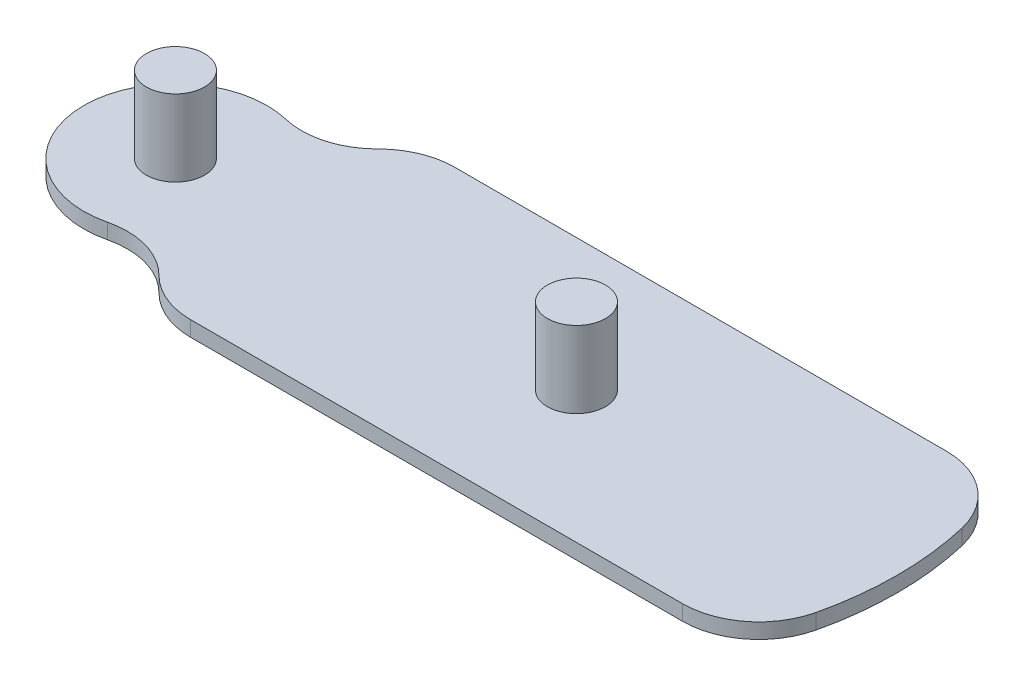
ISO-10303-21;
HEADER;
FILE_DESCRIPTION(('STEP AP214'),'2;1');
FILE_NAME('part.step','',(''),(''),'','','');
FILE_SCHEMA(('AUTOMOTIVE_DESIGN { 1 0 10303 214 1 1 1 1 }'));
ENDSEC;
DATA;
#1=APPLICATION_CONTEXT('core data for automotive mechanical design processes');
#2=APPLICATION_PROTOCOL_DEFINITION('international standard','automotive_design',2000,#1);
#3=PRODUCT_CONTEXT('',#1,'mechanical');
#4=PRODUCT('Part','Part','',(#3));
#5=PRODUCT_RELATED_PRODUCT_CATEGORY('part','',(#4));
#6=PRODUCT_DEFINITION_FORMATION('','',#4);
#7=PRODUCT_DEFINITION_CONTEXT('part definition',#1,'design');
#8=PRODUCT_DEFINITION('design','',#6,#7);
#9=PRODUCT_DEFINITION_SHAPE('','',#8);
#10=(LENGTH_UNIT() NAMED_UNIT(*) SI_UNIT(.MILLI.,.METRE.));
#11=(NAMED_UNIT(*) PLANE_ANGLE_UNIT() SI_UNIT($,.RADIAN.));
#12=(NAMED_UNIT(*) SI_UNIT($,.STERADIAN.) SOLID_ANGLE_UNIT());
#13=UNCERTAINTY_MEASURE_WITH_UNIT(LENGTH_MEASURE(1.E-05),#10,'distance_accuracy_value','');
#14=(GEOMETRIC_REPRESENTATION_CONTEXT(3) GLOBAL_UNCERTAINTY_ASSIGNED_CONTEXT((#13)) GLOBAL_UNIT_ASSIGNED_CONTEXT((#10,
#11,#12)) REPRESENTATION_CONTEXT('',''));
#15=CARTESIAN_POINT('',(0.,0.,0.));
#16=DIRECTION('',(0.,0.,1.));
#17=DIRECTION('',(1.,0.,0.));
#18=AXIS2_PLACEMENT_3D('',#15,#16,#17);
#19=CARTESIAN_POINT('',(52.5,2.,0.));
#20=DIRECTION('',(0.,-1.,0.));
#21=DIRECTION('',(0.,0.,-1.));
#22=AXIS2_PLACEMENT_3D('',#19,#20,#21);
#23=CYLINDRICAL_SURFACE('',#22,42.);
#24=CARTESIAN_POINT('',(52.5,0.,0.));
#25=DIRECTION('',(0.,1.,0.));
#26=DIRECTION('',(0.,0.,1.));
#27=AXIS2_PLACEMENT_3D('',#24,#25,#26);
#28=CIRCLE('',#27,42.);
#29=CARTESIAN_POINT('',(93.3975121206779,0.,9.55999489220589));
#30=VERTEX_POINT('',#29);
#31=CARTESIAN_POINT('',(93.3975121206779,0.,-9.55999489220589));
#32=VERTEX_POINT('',#31);
#33=EDGE_CURVE('E137',#30,#32,#28,.T.);
#34=ORIENTED_EDGE('',*,*,#33,.T.);
#35=DIRECTION('',(0.,-1.,0.));
#36=VECTOR('',#35,1.);
#37=CARTESIAN_POINT('',(93.3975121206779,2.,-9.55999489220589));
#38=LINE('',#37,#36);
#39=CARTESIAN_POINT('',(93.3975121206779,2.,-9.55999489220589));
#40=VERTEX_POINT('',#39);
#41=EDGE_CURVE('E175',#32,#40,#38,.F.);
#42=ORIENTED_EDGE('',*,*,#41,.T.);
#43=CARTESIAN_POINT('',(52.5,2.,0.));
#44=DIRECTION('',(0.,1.,0.));
#45=DIRECTION('',(0.,0.,1.));
#46=AXIS2_PLACEMENT_3D('',#43,#44,#45);
#47=CIRCLE('',#46,42.);
#48=CARTESIAN_POINT('',(93.3975121206779,2.,9.55999489220589));
#49=VERTEX_POINT('',#48);
#50=EDGE_CURVE('E136',#49,#40,#47,.T.);
#51=ORIENTED_EDGE('',*,*,#50,.F.);
#52=DIRECTION('',(0.,-1.,0.));
#53=VECTOR('',#52,1.);
#54=CARTESIAN_POINT('',(93.3975121206779,2.,9.55999489220589));
#55=LINE('',#54,#53);
#56=EDGE_CURVE('E173',#49,#30,#55,.T.);
#57=ORIENTED_EDGE('',*,*,#56,.T.);
#58=EDGE_LOOP('',(#34,#42,#51,#57));
#59=FACE_BOUND('',#58,.T.);
#60=ADVANCED_FACE('F37',(#59),#23,.T.);
#61=CARTESIAN_POINT('',(0.,2.,0.));
#62=DIRECTION('',(0.,-1.,0.));
#63=DIRECTION('',(0.,0.,-1.));
#64=AXIS2_PLACEMENT_3D('',#61,#62,#63);
#65=CYLINDRICAL_SURFACE('',#64,12.);
#66=CARTESIAN_POINT('',(0.,2.,0.));
#67=DIRECTION('',(0.,1.,0.));
#68=DIRECTION('',(0.,0.,1.));
#69=AXIS2_PLACEMENT_3D('',#66,#67,#68);
#70=CIRCLE('',#69,12.);
#71=CARTESIAN_POINT('',(2.78571428571429,2.,-11.6721804269111));
#72=VERTEX_POINT('',#71);
#73=CARTESIAN_POINT('',(2.78571428571429,2.,11.6721804269111));
#74=VERTEX_POINT('',#73);
#75=EDGE_CURVE('E131',#72,#74,#70,.T.);
#76=ORIENTED_EDGE('',*,*,#75,.F.);
#77=DIRECTION('',(0.,-1.,0.));
#78=VECTOR('',#77,1.);
#79=CARTESIAN_POINT('',(2.78571428571429,2.,-11.6721804269111));
#80=LINE('',#79,#78);
#81=CARTESIAN_POINT('',(2.78571428571429,0.,-11.6721804269111));
#82=VERTEX_POINT('',#81);
#83=EDGE_CURVE('E117',#72,#82,#80,.T.);
#84=ORIENTED_EDGE('',*,*,#83,.T.);
#85=CARTESIAN_POINT('',(0.,0.,0.));
#86=DIRECTION('',(0.,1.,0.));
#87=DIRECTION('',(0.,0.,1.));
#88=AXIS2_PLACEMENT_3D('',#85,#86,#87);
#89=CIRCLE('',#88,12.);
#90=CARTESIAN_POINT('',(2.78571428571429,0.,11.6721804269111));
#91=VERTEX_POINT('',#90);
#92=EDGE_CURVE('E128',#82,#91,#89,.T.);
#93=ORIENTED_EDGE('',*,*,#92,.T.);
#94=DIRECTION('',(0.,-1.,0.));
#95=VECTOR('',#94,1.);
#96=CARTESIAN_POINT('',(2.78571428571429,2.,11.6721804269111));
#97=LINE('',#96,#95);
#98=EDGE_CURVE('E132',#91,#74,#97,.F.);
#99=ORIENTED_EDGE('',*,*,#98,.T.);
#100=EDGE_LOOP('',(#76,#84,#93,#99));
#101=FACE_BOUND('',#100,.T.);
#102=ADVANCED_FACE('F127',(#101),#65,.T.);
#103=CARTESIAN_POINT('',(0.,2.,0.));
#104=DIRECTION('',(0.,1.,0.));
#105=DIRECTION('',(0.,0.,1.));
#106=AXIS2_PLACEMENT_3D('',#103,#104,#105);
#107=PLANE('',#106);
#108=DIRECTION('',(1.,0.,0.));
#109=VECTOR('',#108,1.);
#110=CARTESIAN_POINT('',(14.2211538461539,2.,-17.2838056321569));
#111=LINE('',#110,#109);
#112=CARTESIAN_POINT('',(19.2761710512079,2.,-17.2838056321569));
#113=VERTEX_POINT('',#112);
#114=CARTESIAN_POINT('',(83.6600092348022,2.,-17.2838056321569));
#115=VERTEX_POINT('',#114);
#116=EDGE_CURVE('E196',#113,#115,#111,.T.);
#117=ORIENTED_EDGE('',*,*,#116,.F.);
#118=CARTESIAN_POINT('',(19.2761710512079,2.,-7.28380563215687));
#119=DIRECTION('',(0.,1.,0.));
#120=DIRECTION('',(0.,0.,1.));
#121=AXIS2_PLACEMENT_3D('',#118,#119,#120);
#122=CIRCLE('',#121,10.);
#123=CARTESIAN_POINT('',(12.1916569541754,2.,-14.341401540747));
#124=VERTEX_POINT('',#123);
#125=EDGE_CURVE('E163',#113,#124,#122,.T.);
#126=ORIENTED_EDGE('',*,*,#125,.T.);
#127=CARTESIAN_POINT('',(5.10714285714287,2.,-21.3989974493371));
#128=DIRECTION('',(0.,1.,0.));
#129=DIRECTION('',(0.,0.,1.));
#130=AXIS2_PLACEMENT_3D('',#127,#128,#129);
#131=CIRCLE('',#130,10.);
#132=EDGE_CURVE('E122',#124,#72,#131,.F.);
#133=ORIENTED_EDGE('',*,*,#132,.T.);
#134=ORIENTED_EDGE('',*,*,#75,.T.);
#135=CARTESIAN_POINT('',(5.10714285714287,2.,21.3989974493371));
#136=DIRECTION('',(0.,1.,0.));
#137=DIRECTION('',(0.,0.,1.));
#138=AXIS2_PLACEMENT_3D('',#135,#136,#137);
#139=CIRCLE('',#138,10.);
#140=CARTESIAN_POINT('',(12.1916569541754,2.,14.341401540747));
#141=VERTEX_POINT('',#140);
#142=EDGE_CURVE('E149',#74,#141,#139,.F.);
#143=ORIENTED_EDGE('',*,*,#142,.T.);
#144=CARTESIAN_POINT('',(19.2761710512079,2.,7.28380563215687));
#145=DIRECTION('',(0.,1.,0.));
#146=DIRECTION('',(0.,0.,1.));
#147=AXIS2_PLACEMENT_3D('',#144,#145,#146);
#148=CIRCLE('',#147,10.);
#149=CARTESIAN_POINT('',(19.2761710512079,2.,17.2838056321569));
#150=VERTEX_POINT('',#149);
#151=EDGE_CURVE('E157',#141,#150,#148,.T.);
#152=ORIENTED_EDGE('',*,*,#151,.T.);
#153=DIRECTION('',(-1.,0.,0.));
#154=VECTOR('',#153,1.);
#155=CARTESIAN_POINT('',(14.2211538461539,2.,17.2838056321569));
#156=LINE('',#155,#154);
#157=CARTESIAN_POINT('',(83.6600092348022,2.,17.2838056321569));
#158=VERTEX_POINT('',#157);
#159=EDGE_CURVE('E186',#158,#150,#156,.T.);
#160=ORIENTED_EDGE('',*,*,#159,.F.);
#161=CARTESIAN_POINT('',(83.6600092348022,2.,7.28380563215687));
#162=DIRECTION('',(0.,1.,0.));
#163=DIRECTION('',(0.,0.,1.));
#164=AXIS2_PLACEMENT_3D('',#161,#162,#163);
#165=CIRCLE('',#164,10.);
#166=EDGE_CURVE('E159',#158,#49,#165,.T.);
#167=ORIENTED_EDGE('',*,*,#166,.T.);
#168=ORIENTED_EDGE('',*,*,#50,.T.);
#169=CARTESIAN_POINT('',(83.6600092348022,2.,-7.28380563215687));
#170=DIRECTION('',(0.,1.,0.));
#171=DIRECTION('',(0.,0.,1.));
#172=AXIS2_PLACEMENT_3D('',#169,#170,#171);
#173=CIRCLE('',#172,10.);
#174=EDGE_CURVE('E161',#40,#115,#173,.T.);
#175=ORIENTED_EDGE('',*,*,#174,.T.);
#176=EDGE_LOOP('',(#117,#126,#133,#134,#143,#152,#160,#167,#168,#175));
#177=FACE_BOUND('',#176,.T.);
#178=CARTESIAN_POINT('',(52.5,2.,0.));
#179=DIRECTION('',(0.,1.,0.));
#180=DIRECTION('',(0.,0.,1.));
#181=AXIS2_PLACEMENT_3D('',#178,#179,#180);
#182=CIRCLE('',#181,3.8);
#183=CARTESIAN_POINT('',(52.5,2.,3.8));
#184=VERTEX_POINT('',#183);
#185=EDGE_CURVE('E205',#184,#184,#182,.T.);
#186=ORIENTED_EDGE('',*,*,#185,.F.);
#187=EDGE_LOOP('',(#186));
#188=FACE_BOUND('',#187,.T.);
#189=CARTESIAN_POINT('',(0.,2.,0.));
#190=DIRECTION('',(0.,1.,0.));
#191=DIRECTION('',(0.,0.,1.));
#192=AXIS2_PLACEMENT_3D('',#189,#190,#191);
#193=CIRCLE('',#192,3.8);
#194=CARTESIAN_POINT('',(0.,2.,3.8));
#195=VERTEX_POINT('',#194);
#196=EDGE_CURVE('E209',#195,#195,#193,.T.);
#197=ORIENTED_EDGE('',*,*,#196,.F.);
#198=EDGE_LOOP('',(#197));
#199=FACE_BOUND('',#198,.T.);
#200=ADVANCED_FACE('F192',(#177,#188,#199),#107,.T.);
#201=CARTESIAN_POINT('',(0.,0.,0.));
#202=DIRECTION('',(0.,1.,0.));
#203=DIRECTION('',(0.,0.,1.));
#204=AXIS2_PLACEMENT_3D('',#201,#202,#203);
#205=PLANE('',#204);
#206=CARTESIAN_POINT('',(5.10714285714287,0.,-21.3989974493371));
#207=DIRECTION('',(0.,1.,0.));
#208=DIRECTION('',(0.,0.,1.));
#209=AXIS2_PLACEMENT_3D('',#206,#207,#208);
#210=CIRCLE('',#209,10.);
#211=CARTESIAN_POINT('',(12.1916569541754,0.,-14.341401540747));
#212=VERTEX_POINT('',#211);
#213=EDGE_CURVE('E113',#82,#212,#210,.T.);
#214=ORIENTED_EDGE('',*,*,#213,.T.);
#215=CARTESIAN_POINT('',(19.2761710512079,0.,-7.28380563215687));
#216=DIRECTION('',(0.,1.,0.));
#217=DIRECTION('',(0.,0.,1.));
#218=AXIS2_PLACEMENT_3D('',#215,#216,#217);
#219=CIRCLE('',#218,10.);
#220=CARTESIAN_POINT('',(19.2761710512079,0.,-17.2838056321569));
#221=VERTEX_POINT('',#220);
#222=EDGE_CURVE('E171',#212,#221,#219,.F.);
#223=ORIENTED_EDGE('',*,*,#222,.T.);
#224=DIRECTION('',(1.,0.,0.));
#225=VECTOR('',#224,1.);
#226=CARTESIAN_POINT('',(0.,0.,-17.2838056321569));
#227=LINE('',#226,#225);
#228=CARTESIAN_POINT('',(83.6600092348022,0.,-17.2838056321569));
#229=VERTEX_POINT('',#228);
#230=EDGE_CURVE('E198',#221,#229,#227,.T.);
#231=ORIENTED_EDGE('',*,*,#230,.T.);
#232=CARTESIAN_POINT('',(83.6600092348022,0.,-7.28380563215687));
#233=DIRECTION('',(0.,1.,0.));
#234=DIRECTION('',(0.,0.,1.));
#235=AXIS2_PLACEMENT_3D('',#232,#233,#234);
#236=CIRCLE('',#235,10.);
#237=EDGE_CURVE('E169',#229,#32,#236,.F.);
#238=ORIENTED_EDGE('',*,*,#237,.T.);
#239=ORIENTED_EDGE('',*,*,#33,.F.);
#240=CARTESIAN_POINT('',(83.6600092348022,0.,7.28380563215687));
#241=DIRECTION('',(0.,1.,0.));
#242=DIRECTION('',(0.,0.,1.));
#243=AXIS2_PLACEMENT_3D('',#240,#241,#242);
#244=CIRCLE('',#243,10.);
#245=CARTESIAN_POINT('',(83.6600092348022,0.,17.2838056321569));
#246=VERTEX_POINT('',#245);
#247=EDGE_CURVE('E167',#30,#246,#244,.F.);
#248=ORIENTED_EDGE('',*,*,#247,.T.);
#249=DIRECTION('',(-1.,0.,0.));
#250=VECTOR('',#249,1.);
#251=CARTESIAN_POINT('',(0.,0.,17.2838056321569));
#252=LINE('',#251,#250);
#253=CARTESIAN_POINT('',(19.2761710512079,0.,17.2838056321569));
#254=VERTEX_POINT('',#253);
#255=EDGE_CURVE('E187',#246,#254,#252,.T.);
#256=ORIENTED_EDGE('',*,*,#255,.T.);
#257=CARTESIAN_POINT('',(19.2761710512079,0.,7.28380563215687));
#258=DIRECTION('',(0.,1.,0.));
#259=DIRECTION('',(0.,0.,1.));
#260=AXIS2_PLACEMENT_3D('',#257,#258,#259);
#261=CIRCLE('',#260,10.);
#262=CARTESIAN_POINT('',(12.1916569541754,0.,14.341401540747));
#263=VERTEX_POINT('',#262);
#264=EDGE_CURVE('E52',#254,#263,#261,.F.);
#265=ORIENTED_EDGE('',*,*,#264,.T.);
#266=CARTESIAN_POINT('',(5.10714285714287,0.,21.3989974493371));
#267=DIRECTION('',(0.,1.,0.));
#268=DIRECTION('',(0.,0.,1.));
#269=AXIS2_PLACEMENT_3D('',#266,#267,#268);
#270=CIRCLE('',#269,10.);
#271=EDGE_CURVE('E135',#263,#91,#270,.T.);
#272=ORIENTED_EDGE('',*,*,#271,.T.);
#273=ORIENTED_EDGE('',*,*,#92,.F.);
#274=EDGE_LOOP('',(#214,#223,#231,#238,#239,#248,#256,#265,#272,#273));
#275=FACE_BOUND('',#274,.T.);
#276=ADVANCED_FACE('F134',(#275),#205,.F.);
#277=CARTESIAN_POINT('',(0.,12.,0.));
#278=DIRECTION('',(0.,-1.,0.));
#279=DIRECTION('',(0.,0.,-1.));
#280=AXIS2_PLACEMENT_3D('',#277,#278,#279);
#281=CYLINDRICAL_SURFACE('',#280,3.8);
#282=CARTESIAN_POINT('',(0.,12.,0.));
#283=DIRECTION('',(0.,1.,0.));
#284=DIRECTION('',(0.,0.,1.));
#285=AXIS2_PLACEMENT_3D('',#282,#283,#284);
#286=CIRCLE('',#285,3.8);
#287=CARTESIAN_POINT('',(0.,12.,3.8));
#288=VERTEX_POINT('',#287);
#289=EDGE_CURVE('E142',#288,#288,#286,.T.);
#290=ORIENTED_EDGE('',*,*,#289,.F.);
#291=EDGE_LOOP('',(#290));
#292=FACE_BOUND('',#291,.T.);
#293=ORIENTED_EDGE('',*,*,#196,.T.);
#294=EDGE_LOOP('',(#293));
#295=FACE_BOUND('',#294,.T.);
#296=ADVANCED_FACE('F270',(#292,#295),#281,.T.);
#297=CARTESIAN_POINT('',(0.,12.,0.));
#298=DIRECTION('',(0.,1.,0.));
#299=DIRECTION('',(0.,0.,1.));
#300=AXIS2_PLACEMENT_3D('',#297,#298,#299);
#301=PLANE('',#300);
#302=ORIENTED_EDGE('',*,*,#289,.T.);
#303=EDGE_LOOP('',(#302));
#304=FACE_BOUND('',#303,.T.);
#305=ADVANCED_FACE('F266',(#304),#301,.T.);
#306=CARTESIAN_POINT('',(52.5,12.,0.));
#307=DIRECTION('',(0.,-1.,0.));
#308=DIRECTION('',(0.,0.,-1.));
#309=AXIS2_PLACEMENT_3D('',#306,#307,#308);
#310=CYLINDRICAL_SURFACE('',#309,3.8);
#311=CARTESIAN_POINT('',(52.5,12.,0.));
#312=DIRECTION('',(0.,1.,0.));
#313=DIRECTION('',(0.,0.,1.));
#314=AXIS2_PLACEMENT_3D('',#311,#312,#313);
#315=CIRCLE('',#314,3.8);
#316=CARTESIAN_POINT('',(52.5,12.,3.8));
#317=VERTEX_POINT('',#316);
#318=EDGE_CURVE('E206',#317,#317,#315,.T.);
#319=ORIENTED_EDGE('',*,*,#318,.F.);
#320=EDGE_LOOP('',(#319));
#321=FACE_BOUND('',#320,.T.);
#322=ORIENTED_EDGE('',*,*,#185,.T.);
#323=EDGE_LOOP('',(#322));
#324=FACE_BOUND('',#323,.T.);
#325=ADVANCED_FACE('F262',(#321,#324),#310,.T.);
#326=CARTESIAN_POINT('',(52.5,12.,0.));
#327=DIRECTION('',(0.,1.,0.));
#328=DIRECTION('',(0.,0.,1.));
#329=AXIS2_PLACEMENT_3D('',#326,#327,#328);
#330=PLANE('',#329);
#331=ORIENTED_EDGE('',*,*,#318,.T.);
#332=EDGE_LOOP('',(#331));
#333=FACE_BOUND('',#332,.T.);
#334=ADVANCED_FACE('F251',(#333),#330,.T.);
#335=CARTESIAN_POINT('',(5.10714285714287,2.,-21.3989974493371));
#336=DIRECTION('',(0.,1.,0.));
#337=DIRECTION('',(0.,0.,1.));
#338=AXIS2_PLACEMENT_3D('',#335,#336,#337);
#339=CYLINDRICAL_SURFACE('',#338,10.);
#340=ORIENTED_EDGE('',*,*,#132,.F.);
#341=DIRECTION('',(0.,1.,0.));
#342=VECTOR('',#341,1.);
#343=CARTESIAN_POINT('',(12.1916569541754,2.,-14.341401540747));
#344=LINE('',#343,#342);
#345=EDGE_CURVE('E119',#124,#212,#344,.F.);
#346=ORIENTED_EDGE('',*,*,#345,.T.);
#347=ORIENTED_EDGE('',*,*,#213,.F.);
#348=ORIENTED_EDGE('',*,*,#83,.F.);
#349=EDGE_LOOP('',(#340,#346,#347,#348));
#350=FACE_BOUND('',#349,.T.);
#351=ADVANCED_FACE('F116',(#350),#339,.F.);
#352=CARTESIAN_POINT('',(5.10714285714287,2.,21.3989974493371));
#353=DIRECTION('',(0.,1.,0.));
#354=DIRECTION('',(0.,0.,1.));
#355=AXIS2_PLACEMENT_3D('',#352,#353,#354);
#356=CYLINDRICAL_SURFACE('',#355,10.);
#357=ORIENTED_EDGE('',*,*,#271,.F.);
#358=DIRECTION('',(0.,1.,0.));
#359=VECTOR('',#358,1.);
#360=CARTESIAN_POINT('',(12.1916569541754,2.,14.341401540747));
#361=LINE('',#360,#359);
#362=EDGE_CURVE('E11',#263,#141,#361,.T.);
#363=ORIENTED_EDGE('',*,*,#362,.T.);
#364=ORIENTED_EDGE('',*,*,#142,.F.);
#365=ORIENTED_EDGE('',*,*,#98,.F.);
#366=EDGE_LOOP('',(#357,#363,#364,#365));
#367=FACE_BOUND('',#366,.T.);
#368=ADVANCED_FACE('F217',(#367),#356,.F.);
#369=CARTESIAN_POINT('',(14.2211538461539,-8.,17.2838056321569));
#370=DIRECTION('',(0.,0.,-1.));
#371=DIRECTION('',(-1.,0.,0.));
#372=AXIS2_PLACEMENT_3D('',#369,#370,#371);
#373=PLANE('',#372);
#374=ORIENTED_EDGE('',*,*,#255,.F.);
#375=DIRECTION('',(0.,-1.,0.));
#376=VECTOR('',#375,1.);
#377=CARTESIAN_POINT('',(83.6600092348022,-8.,17.2838056321569));
#378=LINE('',#377,#376);
#379=EDGE_CURVE('E45',#246,#158,#378,.F.);
#380=ORIENTED_EDGE('',*,*,#379,.T.);
#381=ORIENTED_EDGE('',*,*,#159,.T.);
#382=DIRECTION('',(0.,1.,0.));
#383=VECTOR('',#382,1.);
#384=CARTESIAN_POINT('',(19.2761710512079,-8.,17.2838056321569));
#385=LINE('',#384,#383);
#386=EDGE_CURVE('E178',#150,#254,#385,.F.);
#387=ORIENTED_EDGE('',*,*,#386,.T.);
#388=EDGE_LOOP('',(#374,#380,#381,#387));
#389=FACE_BOUND('',#388,.T.);
#390=ADVANCED_FACE('F185',(#389),#373,.F.);
#391=CARTESIAN_POINT('',(14.2211538461539,-8.,-17.2838056321569));
#392=DIRECTION('',(0.,0.,1.));
#393=DIRECTION('',(1.,0.,0.));
#394=AXIS2_PLACEMENT_3D('',#391,#392,#393);
#395=PLANE('',#394);
#396=ORIENTED_EDGE('',*,*,#230,.F.);
#397=DIRECTION('',(0.,1.,0.));
#398=VECTOR('',#397,1.);
#399=CARTESIAN_POINT('',(19.2761710512079,-8.,-17.2838056321569));
#400=LINE('',#399,#398);
#401=EDGE_CURVE('E154',#221,#113,#400,.T.);
#402=ORIENTED_EDGE('',*,*,#401,.T.);
#403=ORIENTED_EDGE('',*,*,#116,.T.);
#404=DIRECTION('',(0.,-1.,0.));
#405=VECTOR('',#404,1.);
#406=CARTESIAN_POINT('',(83.6600092348022,-8.,-17.2838056321569));
#407=LINE('',#406,#405);
#408=EDGE_CURVE('E152',#115,#229,#407,.T.);
#409=ORIENTED_EDGE('',*,*,#408,.T.);
#410=EDGE_LOOP('',(#396,#402,#403,#409));
#411=FACE_BOUND('',#410,.T.);
#412=ADVANCED_FACE('F227',(#411),#395,.F.);
#413=CARTESIAN_POINT('',(19.2761710512079,2.,-7.28380563215687));
#414=DIRECTION('',(0.,1.,0.));
#415=DIRECTION('',(0.,0.,1.));
#416=AXIS2_PLACEMENT_3D('',#413,#414,#415);
#417=CYLINDRICAL_SURFACE('',#416,10.);
#418=ORIENTED_EDGE('',*,*,#222,.F.);
#419=ORIENTED_EDGE('',*,*,#345,.F.);
#420=ORIENTED_EDGE('',*,*,#125,.F.);
#421=ORIENTED_EDGE('',*,*,#401,.F.);
#422=EDGE_LOOP('',(#418,#419,#420,#421));
#423=FACE_BOUND('',#422,.T.);
#424=ADVANCED_FACE('F232',(#423),#417,.T.);
#425=CARTESIAN_POINT('',(83.6600092348022,2.,-7.28380563215687));
#426=DIRECTION('',(0.,-1.,0.));
#427=DIRECTION('',(0.,0.,-1.));
#428=AXIS2_PLACEMENT_3D('',#425,#426,#427);
#429=CYLINDRICAL_SURFACE('',#428,10.);
#430=ORIENTED_EDGE('',*,*,#237,.F.);
#431=ORIENTED_EDGE('',*,*,#408,.F.);
#432=ORIENTED_EDGE('',*,*,#174,.F.);
#433=ORIENTED_EDGE('',*,*,#41,.F.);
#434=EDGE_LOOP('',(#430,#431,#432,#433));
#435=FACE_BOUND('',#434,.T.);
#436=ADVANCED_FACE('F230',(#435),#429,.T.);
#437=CARTESIAN_POINT('',(83.6600092348022,2.,7.28380563215687));
#438=DIRECTION('',(0.,-1.,0.));
#439=DIRECTION('',(0.,0.,-1.));
#440=AXIS2_PLACEMENT_3D('',#437,#438,#439);
#441=CYLINDRICAL_SURFACE('',#440,10.);
#442=ORIENTED_EDGE('',*,*,#247,.F.);
#443=ORIENTED_EDGE('',*,*,#56,.F.);
#444=ORIENTED_EDGE('',*,*,#166,.F.);
#445=ORIENTED_EDGE('',*,*,#379,.F.);
#446=EDGE_LOOP('',(#442,#443,#444,#445));
#447=FACE_BOUND('',#446,.T.);
#448=ADVANCED_FACE('F220',(#447),#441,.T.);
#449=CARTESIAN_POINT('',(19.2761710512079,2.,7.28380563215687));
#450=DIRECTION('',(0.,1.,0.));
#451=DIRECTION('',(0.,0.,1.));
#452=AXIS2_PLACEMENT_3D('',#449,#450,#451);
#453=CYLINDRICAL_SURFACE('',#452,10.);
#454=ORIENTED_EDGE('',*,*,#151,.F.);
#455=ORIENTED_EDGE('',*,*,#362,.F.);
#456=ORIENTED_EDGE('',*,*,#264,.F.);
#457=ORIENTED_EDGE('',*,*,#386,.F.);
#458=EDGE_LOOP('',(#454,#455,#456,#457));
#459=FACE_BOUND('',#458,.T.);
#460=ADVANCED_FACE('F39',(#459),#453,.T.);
#461=CLOSED_SHELL('',(#60,#102,#200,#276,#296,#305,#325,#334,#351,#368,#390,#412,#424,#436,#448,#460));
#462=MANIFOLD_SOLID_BREP('B2',#461);
#463=ADVANCED_BREP_SHAPE_REPRESENTATION('',(#18,#462),#14);
#464=SHAPE_DEFINITION_REPRESENTATION(#9,#463);
ENDSEC;
END-ISO-10303-21;
